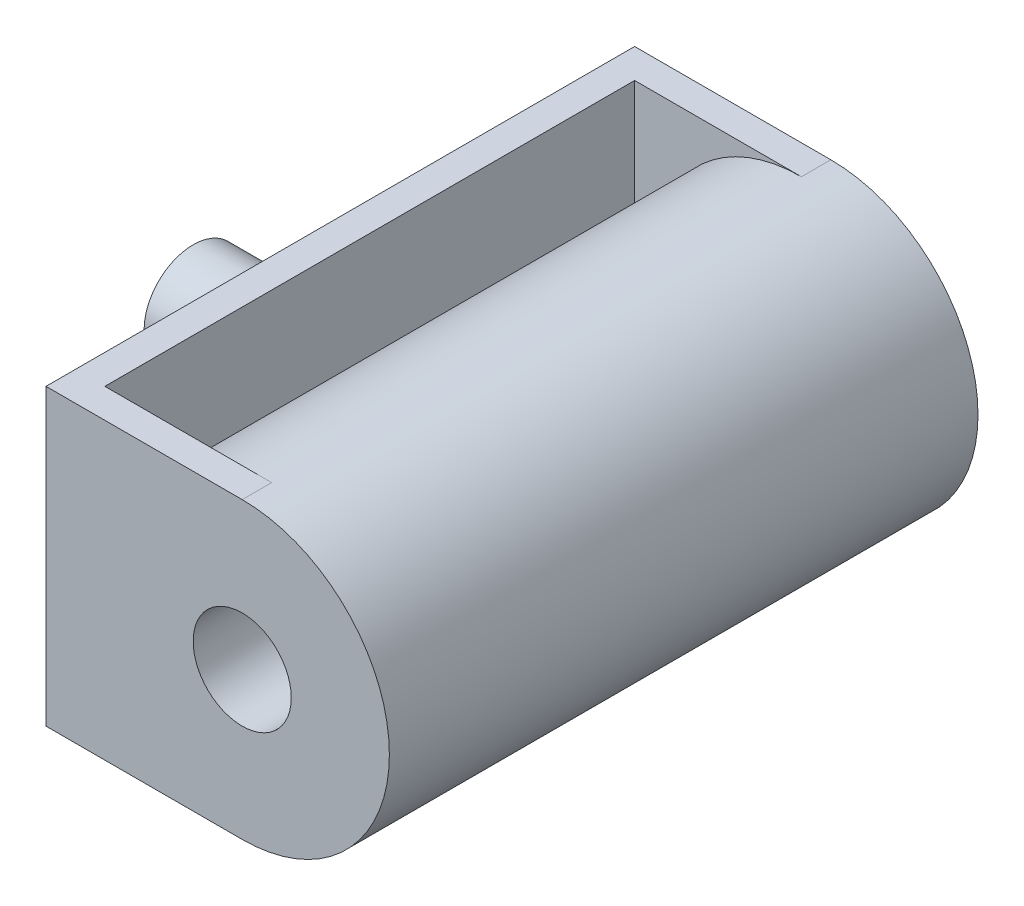
ISO-10303-21;
HEADER;
FILE_DESCRIPTION(('STEP AP214'),'2;1');
FILE_NAME('part.step','',(''),(''),'','','');
FILE_SCHEMA(('AUTOMOTIVE_DESIGN { 1 0 10303 214 1 1 1 1 }'));
ENDSEC;
DATA;
#1=APPLICATION_CONTEXT('core data for automotive mechanical design processes');
#2=APPLICATION_PROTOCOL_DEFINITION('international standard','automotive_design',2000,#1);
#3=PRODUCT_CONTEXT('',#1,'mechanical');
#4=PRODUCT('Part','Part','',(#3));
#5=PRODUCT_RELATED_PRODUCT_CATEGORY('part','',(#4));
#6=PRODUCT_DEFINITION_FORMATION('','',#4);
#7=PRODUCT_DEFINITION_CONTEXT('part definition',#1,'design');
#8=PRODUCT_DEFINITION('design','',#6,#7);
#9=PRODUCT_DEFINITION_SHAPE('','',#8);
#10=(LENGTH_UNIT() NAMED_UNIT(*) SI_UNIT(.MILLI.,.METRE.));
#11=(NAMED_UNIT(*) PLANE_ANGLE_UNIT() SI_UNIT($,.RADIAN.));
#12=(NAMED_UNIT(*) SI_UNIT($,.STERADIAN.) SOLID_ANGLE_UNIT());
#13=UNCERTAINTY_MEASURE_WITH_UNIT(LENGTH_MEASURE(1.E-05),#10,'distance_accuracy_value','');
#14=(GEOMETRIC_REPRESENTATION_CONTEXT(3) GLOBAL_UNCERTAINTY_ASSIGNED_CONTEXT((#13)) GLOBAL_UNIT_ASSIGNED_CONTEXT((#10,
#11,#12)) REPRESENTATION_CONTEXT('',''));
#15=CARTESIAN_POINT('',(0.,0.,0.));
#16=DIRECTION('',(0.,0.,1.));
#17=DIRECTION('',(1.,0.,0.));
#18=AXIS2_PLACEMENT_3D('',#15,#16,#17);
#19=CARTESIAN_POINT('',(0.,0.,60.));
#20=DIRECTION('',(0.,0.,-1.));
#21=DIRECTION('',(-1.,0.,0.));
#22=AXIS2_PLACEMENT_3D('',#19,#20,#21);
#23=CYLINDRICAL_SURFACE('',#22,15.);
#24=CARTESIAN_POINT('',(0.,0.,3.));
#25=DIRECTION('',(0.,0.,1.));
#26=DIRECTION('',(1.,0.,0.));
#27=AXIS2_PLACEMENT_3D('',#24,#25,#26);
#28=CIRCLE('',#27,15.);
#29=CARTESIAN_POINT('',(0.,15.,3.));
#30=VERTEX_POINT('',#29);
#31=CARTESIAN_POINT('',(0.,-15.,3.));
#32=VERTEX_POINT('',#31);
#33=EDGE_CURVE('E42',#30,#32,#28,.T.);
#34=ORIENTED_EDGE('',*,*,#33,.T.);
#35=DIRECTION('',(0.,0.,-1.));
#36=VECTOR('',#35,1.);
#37=CARTESIAN_POINT('',(0.,-15.,0.));
#38=LINE('',#37,#36);
#39=CARTESIAN_POINT('',(0.,-15.,0.));
#40=VERTEX_POINT('',#39);
#41=EDGE_CURVE('E141',#32,#40,#38,.T.);
#42=ORIENTED_EDGE('',*,*,#41,.T.);
#43=CARTESIAN_POINT('',(0.,0.,0.));
#44=DIRECTION('',(0.,0.,1.));
#45=DIRECTION('',(1.,0.,0.));
#46=AXIS2_PLACEMENT_3D('',#43,#44,#45);
#47=CIRCLE('',#46,15.);
#48=CARTESIAN_POINT('',(0.,15.,0.));
#49=VERTEX_POINT('',#48);
#50=EDGE_CURVE('E157',#40,#49,#47,.T.);
#51=ORIENTED_EDGE('',*,*,#50,.T.);
#52=DIRECTION('',(0.,0.,-1.));
#53=VECTOR('',#52,1.);
#54=CARTESIAN_POINT('',(0.,15.,0.));
#55=LINE('',#54,#53);
#56=EDGE_CURVE('E128',#30,#49,#55,.T.);
#57=ORIENTED_EDGE('',*,*,#56,.F.);
#58=EDGE_LOOP('',(#34,#42,#51,#57));
#59=FACE_BOUND('',#58,.T.);
#60=DIRECTION('',(0.,0.,1.));
#61=VECTOR('',#60,1.);
#62=CARTESIAN_POINT('',(0.,-15.,60.));
#63=LINE('',#62,#61);
#64=CARTESIAN_POINT('',(0.,-15.,57.));
#65=VERTEX_POINT('',#64);
#66=CARTESIAN_POINT('',(0.,-15.,60.));
#67=VERTEX_POINT('',#66);
#68=EDGE_CURVE('E49',#65,#67,#63,.T.);
#69=ORIENTED_EDGE('',*,*,#68,.F.);
#70=CARTESIAN_POINT('',(0.,0.,57.));
#71=DIRECTION('',(0.,0.,1.));
#72=DIRECTION('',(1.,0.,0.));
#73=AXIS2_PLACEMENT_3D('',#70,#71,#72);
#74=CIRCLE('',#73,15.);
#75=CARTESIAN_POINT('',(0.,15.,57.));
#76=VERTEX_POINT('',#75);
#77=EDGE_CURVE('E11',#76,#65,#74,.T.);
#78=ORIENTED_EDGE('',*,*,#77,.F.);
#79=DIRECTION('',(0.,0.,1.));
#80=VECTOR('',#79,1.);
#81=CARTESIAN_POINT('',(0.,15.,60.));
#82=LINE('',#81,#80);
#83=CARTESIAN_POINT('',(0.,15.,60.));
#84=VERTEX_POINT('',#83);
#85=EDGE_CURVE('E95',#76,#84,#82,.T.);
#86=ORIENTED_EDGE('',*,*,#85,.T.);
#87=CARTESIAN_POINT('',(0.,0.,60.));
#88=DIRECTION('',(0.,0.,1.));
#89=DIRECTION('',(1.,0.,0.));
#90=AXIS2_PLACEMENT_3D('',#87,#88,#89);
#91=CIRCLE('',#90,15.);
#92=EDGE_CURVE('E53',#67,#84,#91,.T.);
#93=ORIENTED_EDGE('',*,*,#92,.F.);
#94=EDGE_LOOP('',(#69,#78,#86,#93));
#95=FACE_BOUND('',#94,.T.);
#96=ADVANCED_FACE('F34',(#59,#95),#23,.T.);
#97=CARTESIAN_POINT('',(0.,0.,60.));
#98=DIRECTION('',(0.,0.,1.));
#99=DIRECTION('',(1.,0.,0.));
#100=AXIS2_PLACEMENT_3D('',#97,#98,#99);
#101=PLANE('',#100);
#102=CARTESIAN_POINT('',(0.,0.,60.));
#103=DIRECTION('',(0.,0.,1.));
#104=DIRECTION('',(1.,0.,0.));
#105=AXIS2_PLACEMENT_3D('',#102,#103,#104);
#106=CIRCLE('',#105,5.);
#107=CARTESIAN_POINT('',(5.,0.,60.));
#108=VERTEX_POINT('',#107);
#109=EDGE_CURVE('E308',#108,#108,#106,.T.);
#110=ORIENTED_EDGE('',*,*,#109,.F.);
#111=EDGE_LOOP('',(#110));
#112=FACE_BOUND('',#111,.T.);
#113=ORIENTED_EDGE('',*,*,#92,.T.);
#114=DIRECTION('',(-1.,0.,0.));
#115=VECTOR('',#114,1.);
#116=CARTESIAN_POINT('',(0.,15.,60.));
#117=LINE('',#116,#115);
#118=CARTESIAN_POINT('',(-20.,15.,60.));
#119=VERTEX_POINT('',#118);
#120=EDGE_CURVE('E108',#84,#119,#117,.T.);
#121=ORIENTED_EDGE('',*,*,#120,.T.);
#122=DIRECTION('',(0.,1.,0.));
#123=VECTOR('',#122,1.);
#124=CARTESIAN_POINT('',(-20.,-15.,60.));
#125=LINE('',#124,#123);
#126=CARTESIAN_POINT('',(-20.,-15.,60.));
#127=VERTEX_POINT('',#126);
#128=EDGE_CURVE('E125',#127,#119,#125,.T.);
#129=ORIENTED_EDGE('',*,*,#128,.F.);
#130=DIRECTION('',(-1.,0.,0.));
#131=VECTOR('',#130,1.);
#132=CARTESIAN_POINT('',(0.,-15.,60.));
#133=LINE('',#132,#131);
#134=EDGE_CURVE('E122',#67,#127,#133,.T.);
#135=ORIENTED_EDGE('',*,*,#134,.F.);
#136=EDGE_LOOP('',(#113,#121,#129,#135));
#137=FACE_BOUND('',#136,.T.);
#138=ADVANCED_FACE('F177',(#112,#137),#101,.T.);
#139=CARTESIAN_POINT('',(0.,0.,0.));
#140=DIRECTION('',(0.,0.,1.));
#141=DIRECTION('',(1.,0.,0.));
#142=AXIS2_PLACEMENT_3D('',#139,#140,#141);
#143=PLANE('',#142);
#144=CARTESIAN_POINT('',(0.,0.,0.));
#145=DIRECTION('',(0.,0.,1.));
#146=DIRECTION('',(1.,0.,0.));
#147=AXIS2_PLACEMENT_3D('',#144,#145,#146);
#148=CIRCLE('',#147,5.);
#149=CARTESIAN_POINT('',(5.,0.,0.));
#150=VERTEX_POINT('',#149);
#151=EDGE_CURVE('E37',#150,#150,#148,.T.);
#152=ORIENTED_EDGE('',*,*,#151,.T.);
#153=EDGE_LOOP('',(#152));
#154=FACE_BOUND('',#153,.T.);
#155=ORIENTED_EDGE('',*,*,#50,.F.);
#156=DIRECTION('',(-1.,0.,0.));
#157=VECTOR('',#156,1.);
#158=CARTESIAN_POINT('',(0.,-15.,0.));
#159=LINE('',#158,#157);
#160=CARTESIAN_POINT('',(-20.,-15.,0.));
#161=VERTEX_POINT('',#160);
#162=EDGE_CURVE('E143',#40,#161,#159,.T.);
#163=ORIENTED_EDGE('',*,*,#162,.T.);
#164=DIRECTION('',(0.,1.,0.));
#165=VECTOR('',#164,1.);
#166=CARTESIAN_POINT('',(-20.,-15.,0.));
#167=LINE('',#166,#165);
#168=CARTESIAN_POINT('',(-20.,15.,0.));
#169=VERTEX_POINT('',#168);
#170=EDGE_CURVE('E154',#161,#169,#167,.T.);
#171=ORIENTED_EDGE('',*,*,#170,.T.);
#172=DIRECTION('',(-1.,0.,0.));
#173=VECTOR('',#172,1.);
#174=CARTESIAN_POINT('',(0.,15.,0.));
#175=LINE('',#174,#173);
#176=EDGE_CURVE('E131',#49,#169,#175,.T.);
#177=ORIENTED_EDGE('',*,*,#176,.F.);
#178=EDGE_LOOP('',(#155,#163,#171,#177));
#179=FACE_BOUND('',#178,.T.);
#180=ADVANCED_FACE('F183',(#154,#179),#143,.F.);
#181=CARTESIAN_POINT('',(-17.,-15.,3.));
#182=DIRECTION('',(0.,0.,1.));
#183=DIRECTION('',(1.,0.,0.));
#184=AXIS2_PLACEMENT_3D('',#181,#182,#183);
#185=PLANE('',#184);
#186=ORIENTED_EDGE('',*,*,#33,.F.);
#187=DIRECTION('',(1.,0.,0.));
#188=VECTOR('',#187,1.);
#189=CARTESIAN_POINT('',(-17.,15.,3.));
#190=LINE('',#189,#188);
#191=CARTESIAN_POINT('',(-17.,15.,3.));
#192=VERTEX_POINT('',#191);
#193=EDGE_CURVE('E138',#192,#30,#190,.T.);
#194=ORIENTED_EDGE('',*,*,#193,.F.);
#195=DIRECTION('',(0.,1.,0.));
#196=VECTOR('',#195,1.);
#197=CARTESIAN_POINT('',(-17.,-15.,3.));
#198=LINE('',#197,#196);
#199=CARTESIAN_POINT('',(-17.,-15.,3.));
#200=VERTEX_POINT('',#199);
#201=EDGE_CURVE('E155',#200,#192,#198,.T.);
#202=ORIENTED_EDGE('',*,*,#201,.F.);
#203=DIRECTION('',(1.,0.,0.));
#204=VECTOR('',#203,1.);
#205=CARTESIAN_POINT('',(-17.,-15.,3.));
#206=LINE('',#205,#204);
#207=EDGE_CURVE('E151',#200,#32,#206,.T.);
#208=ORIENTED_EDGE('',*,*,#207,.T.);
#209=EDGE_LOOP('',(#186,#194,#202,#208));
#210=FACE_BOUND('',#209,.T.);
#211=ADVANCED_FACE('F172',(#210),#185,.T.);
#212=CARTESIAN_POINT('',(-17.,-15.,30.));
#213=DIRECTION('',(1.,0.,0.));
#214=DIRECTION('',(0.,0.,-1.));
#215=AXIS2_PLACEMENT_3D('',#212,#213,#214);
#216=PLANE('',#215);
#217=ORIENTED_EDGE('',*,*,#201,.T.);
#218=DIRECTION('',(0.,0.,-1.));
#219=VECTOR('',#218,1.);
#220=CARTESIAN_POINT('',(-17.,15.,30.));
#221=LINE('',#220,#219);
#222=CARTESIAN_POINT('',(-17.,15.,57.));
#223=VERTEX_POINT('',#222);
#224=EDGE_CURVE('E136',#223,#192,#221,.T.);
#225=ORIENTED_EDGE('',*,*,#224,.F.);
#226=DIRECTION('',(0.,1.,0.));
#227=VECTOR('',#226,1.);
#228=CARTESIAN_POINT('',(-17.,-15.,57.));
#229=LINE('',#228,#227);
#230=CARTESIAN_POINT('',(-17.,-15.,57.));
#231=VERTEX_POINT('',#230);
#232=EDGE_CURVE('E114',#231,#223,#229,.T.);
#233=ORIENTED_EDGE('',*,*,#232,.F.);
#234=DIRECTION('',(0.,0.,-1.));
#235=VECTOR('',#234,1.);
#236=CARTESIAN_POINT('',(-17.,-15.,30.));
#237=LINE('',#236,#235);
#238=EDGE_CURVE('E148',#231,#200,#237,.T.);
#239=ORIENTED_EDGE('',*,*,#238,.T.);
#240=EDGE_LOOP('',(#217,#225,#233,#239));
#241=FACE_BOUND('',#240,.T.);
#242=ADVANCED_FACE('F174',(#241),#216,.T.);
#243=CARTESIAN_POINT('',(-20.,-15.,0.));
#244=DIRECTION('',(-1.,0.,0.));
#245=DIRECTION('',(0.,0.,1.));
#246=AXIS2_PLACEMENT_3D('',#243,#244,#245);
#247=PLANE('',#246);
#248=CARTESIAN_POINT('',(-20.,0.,30.));
#249=DIRECTION('',(-1.,0.,0.));
#250=DIRECTION('',(0.,0.,1.));
#251=AXIS2_PLACEMENT_3D('',#248,#249,#250);
#252=CIRCLE('',#251,4.99999999999999);
#253=CARTESIAN_POINT('',(-20.,0.,35.));
#254=VERTEX_POINT('',#253);
#255=EDGE_CURVE('E304',#254,#254,#252,.T.);
#256=ORIENTED_EDGE('',*,*,#255,.F.);
#257=EDGE_LOOP('',(#256));
#258=FACE_BOUND('',#257,.T.);
#259=DIRECTION('',(0.,0.,1.));
#260=VECTOR('',#259,1.);
#261=CARTESIAN_POINT('',(-20.,-15.,0.));
#262=LINE('',#261,#260);
#263=EDGE_CURVE('E146',#161,#127,#262,.T.);
#264=ORIENTED_EDGE('',*,*,#263,.T.);
#265=ORIENTED_EDGE('',*,*,#128,.T.);
#266=DIRECTION('',(0.,0.,1.));
#267=VECTOR('',#266,1.);
#268=CARTESIAN_POINT('',(-20.,15.,0.));
#269=LINE('',#268,#267);
#270=EDGE_CURVE('E134',#169,#119,#269,.T.);
#271=ORIENTED_EDGE('',*,*,#270,.F.);
#272=ORIENTED_EDGE('',*,*,#170,.F.);
#273=EDGE_LOOP('',(#264,#265,#271,#272));
#274=FACE_BOUND('',#273,.T.);
#275=ADVANCED_FACE('F180',(#258,#274),#247,.T.);
#276=CARTESIAN_POINT('',(0.,-15.,0.));
#277=DIRECTION('',(0.,1.,0.));
#278=DIRECTION('',(0.,0.,1.));
#279=AXIS2_PLACEMENT_3D('',#276,#277,#278);
#280=PLANE('',#279);
#281=ORIENTED_EDGE('',*,*,#41,.F.);
#282=ORIENTED_EDGE('',*,*,#207,.F.);
#283=ORIENTED_EDGE('',*,*,#238,.F.);
#284=DIRECTION('',(1.,0.,0.));
#285=VECTOR('',#284,1.);
#286=CARTESIAN_POINT('',(-17.,-15.,57.));
#287=LINE('',#286,#285);
#288=EDGE_CURVE('E120',#231,#65,#287,.T.);
#289=ORIENTED_EDGE('',*,*,#288,.T.);
#290=ORIENTED_EDGE('',*,*,#68,.T.);
#291=ORIENTED_EDGE('',*,*,#134,.T.);
#292=ORIENTED_EDGE('',*,*,#263,.F.);
#293=ORIENTED_EDGE('',*,*,#162,.F.);
#294=EDGE_LOOP('',(#281,#282,#283,#289,#290,#291,#292,#293));
#295=FACE_BOUND('',#294,.T.);
#296=ADVANCED_FACE('F170',(#295),#280,.F.);
#297=CARTESIAN_POINT('',(0.,15.,0.));
#298=DIRECTION('',(0.,1.,0.));
#299=DIRECTION('',(0.,0.,1.));
#300=AXIS2_PLACEMENT_3D('',#297,#298,#299);
#301=PLANE('',#300);
#302=ORIENTED_EDGE('',*,*,#56,.T.);
#303=ORIENTED_EDGE('',*,*,#176,.T.);
#304=ORIENTED_EDGE('',*,*,#270,.T.);
#305=ORIENTED_EDGE('',*,*,#120,.F.);
#306=ORIENTED_EDGE('',*,*,#85,.F.);
#307=DIRECTION('',(1.,0.,0.));
#308=VECTOR('',#307,1.);
#309=CARTESIAN_POINT('',(-17.,15.,57.));
#310=LINE('',#309,#308);
#311=EDGE_CURVE('E106',#223,#76,#310,.T.);
#312=ORIENTED_EDGE('',*,*,#311,.F.);
#313=ORIENTED_EDGE('',*,*,#224,.T.);
#314=ORIENTED_EDGE('',*,*,#193,.T.);
#315=EDGE_LOOP('',(#302,#303,#304,#305,#306,#312,#313,#314));
#316=FACE_BOUND('',#315,.T.);
#317=ADVANCED_FACE('F104',(#316),#301,.T.);
#318=CARTESIAN_POINT('',(-17.,-15.,57.));
#319=DIRECTION('',(0.,0.,1.));
#320=DIRECTION('',(1.,0.,0.));
#321=AXIS2_PLACEMENT_3D('',#318,#319,#320);
#322=PLANE('',#321);
#323=ORIENTED_EDGE('',*,*,#311,.T.);
#324=ORIENTED_EDGE('',*,*,#77,.T.);
#325=ORIENTED_EDGE('',*,*,#288,.F.);
#326=ORIENTED_EDGE('',*,*,#232,.T.);
#327=EDGE_LOOP('',(#323,#324,#325,#326));
#328=FACE_BOUND('',#327,.T.);
#329=ADVANCED_FACE('F112',(#328),#322,.F.);
#330=CARTESIAN_POINT('',(-35.,0.,30.));
#331=DIRECTION('',(1.,0.,0.));
#332=DIRECTION('',(0.,0.,-1.));
#333=AXIS2_PLACEMENT_3D('',#330,#331,#332);
#334=CYLINDRICAL_SURFACE('',#333,4.99999999999999);
#335=CARTESIAN_POINT('',(-35.,0.,30.));
#336=DIRECTION('',(-1.,0.,0.));
#337=DIRECTION('',(0.,0.,1.));
#338=AXIS2_PLACEMENT_3D('',#335,#336,#337);
#339=CIRCLE('',#338,4.99999999999999);
#340=CARTESIAN_POINT('',(-35.,0.,35.));
#341=VERTEX_POINT('',#340);
#342=EDGE_CURVE('E109',#341,#341,#339,.T.);
#343=ORIENTED_EDGE('',*,*,#342,.F.);
#344=EDGE_LOOP('',(#343));
#345=FACE_BOUND('',#344,.T.);
#346=ORIENTED_EDGE('',*,*,#255,.T.);
#347=EDGE_LOOP('',(#346));
#348=FACE_BOUND('',#347,.T.);
#349=ADVANCED_FACE('F233',(#345,#348),#334,.T.);
#350=CARTESIAN_POINT('',(-35.,0.,30.));
#351=DIRECTION('',(-1.,0.,0.));
#352=DIRECTION('',(0.,0.,1.));
#353=AXIS2_PLACEMENT_3D('',#350,#351,#352);
#354=PLANE('',#353);
#355=ORIENTED_EDGE('',*,*,#342,.T.);
#356=EDGE_LOOP('',(#355));
#357=FACE_BOUND('',#356,.T.);
#358=ADVANCED_FACE('F210',(#357),#354,.T.);
#359=CARTESIAN_POINT('',(0.,0.,-86.));
#360=DIRECTION('',(0.,0.,1.));
#361=DIRECTION('',(1.,0.,0.));
#362=AXIS2_PLACEMENT_3D('',#359,#360,#361);
#363=CYLINDRICAL_SURFACE('',#362,5.);
#364=ORIENTED_EDGE('',*,*,#109,.T.);
#365=EDGE_LOOP('',(#364));
#366=FACE_BOUND('',#365,.T.);
#367=ORIENTED_EDGE('',*,*,#151,.F.);
#368=EDGE_LOOP('',(#367));
#369=FACE_BOUND('',#368,.T.);
#370=ADVANCED_FACE('F222',(#366,#369),#363,.F.);
#371=CLOSED_SHELL('',(#96,#138,#180,#211,#242,#275,#296,#317,#329,#349,#358,#370));
#372=MANIFOLD_SOLID_BREP('B2',#371);
#373=ADVANCED_BREP_SHAPE_REPRESENTATION('',(#18,#372),#14);
#374=SHAPE_DEFINITION_REPRESENTATION(#9,#373);
ENDSEC;
END-ISO-10303-21;
